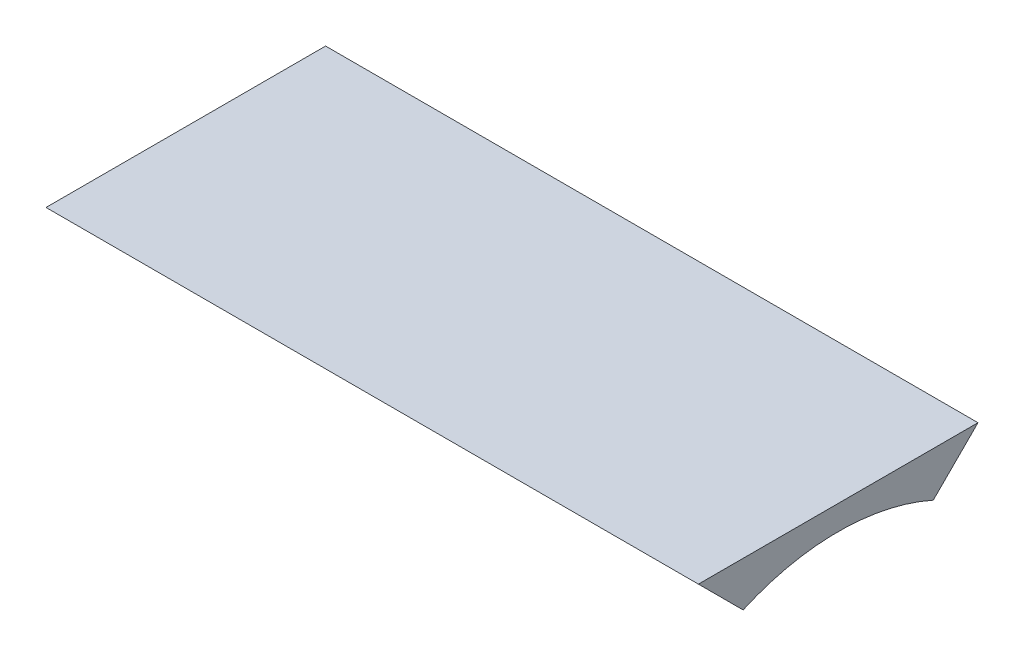
ISO-10303-21;
HEADER;
FILE_DESCRIPTION(('STEP AP214'),'2;1');
FILE_NAME('part.step','',(''),(''),'','','');
FILE_SCHEMA(('AUTOMOTIVE_DESIGN { 1 0 10303 214 1 1 1 1 }'));
ENDSEC;
DATA;
#1=APPLICATION_CONTEXT('core data for automotive mechanical design processes');
#2=APPLICATION_PROTOCOL_DEFINITION('international standard','automotive_design',2000,#1);
#3=PRODUCT_CONTEXT('',#1,'mechanical');
#4=PRODUCT('Part','Part','',(#3));
#5=PRODUCT_RELATED_PRODUCT_CATEGORY('part','',(#4));
#6=PRODUCT_DEFINITION_FORMATION('','',#4);
#7=PRODUCT_DEFINITION_CONTEXT('part definition',#1,'design');
#8=PRODUCT_DEFINITION('design','',#6,#7);
#9=PRODUCT_DEFINITION_SHAPE('','',#8);
#10=(LENGTH_UNIT() NAMED_UNIT(*) SI_UNIT(.MILLI.,.METRE.));
#11=(NAMED_UNIT(*) PLANE_ANGLE_UNIT() SI_UNIT($,.RADIAN.));
#12=(NAMED_UNIT(*) SI_UNIT($,.STERADIAN.) SOLID_ANGLE_UNIT());
#13=UNCERTAINTY_MEASURE_WITH_UNIT(LENGTH_MEASURE(1.E-05),#10,'distance_accuracy_value','');
#14=(GEOMETRIC_REPRESENTATION_CONTEXT(3) GLOBAL_UNCERTAINTY_ASSIGNED_CONTEXT((#13)) GLOBAL_UNIT_ASSIGNED_CONTEXT((#10,
#11,#12)) REPRESENTATION_CONTEXT('',''));
#15=CARTESIAN_POINT('',(0.,0.,0.));
#16=DIRECTION('',(0.,0.,1.));
#17=DIRECTION('',(1.,0.,0.));
#18=AXIS2_PLACEMENT_3D('',#15,#16,#17);
#19=CARTESIAN_POINT('',(70.,0.,0.));
#20=DIRECTION('',(-1.,0.,0.));
#21=DIRECTION('',(0.,0.,1.));
#22=AXIS2_PLACEMENT_3D('',#19,#20,#21);
#23=CYLINDRICAL_SURFACE('',#22,25.);
#24=CARTESIAN_POINT('',(0.,0.,0.));
#25=DIRECTION('',(1.,0.,0.));
#26=DIRECTION('',(0.,0.,-1.));
#27=AXIS2_PLACEMENT_3D('',#24,#25,#26);
#28=CIRCLE('',#27,25.);
#29=CARTESIAN_POINT('',(0.,22.8245481882994,-10.1999999999999));
#30=VERTEX_POINT('',#29);
#31=CARTESIAN_POINT('',(0.,22.8245481882994,10.1999999999999));
#32=VERTEX_POINT('',#31);
#33=EDGE_CURVE('E98',#30,#32,#28,.T.);
#34=ORIENTED_EDGE('',*,*,#33,.F.);
#35=DIRECTION('',(-1.,0.,0.));
#36=VECTOR('',#35,1.);
#37=CARTESIAN_POINT('',(70.,22.8245481882994,-10.1999999999999));
#38=LINE('',#37,#36);
#39=CARTESIAN_POINT('',(70.,22.8245481882994,-10.1999999999999));
#40=VERTEX_POINT('',#39);
#41=EDGE_CURVE('E11',#40,#30,#38,.T.);
#42=ORIENTED_EDGE('',*,*,#41,.F.);
#43=CARTESIAN_POINT('',(70.,0.,0.));
#44=DIRECTION('',(1.,0.,0.));
#45=DIRECTION('',(0.,0.,-1.));
#46=AXIS2_PLACEMENT_3D('',#43,#44,#45);
#47=CIRCLE('',#46,25.);
#48=CARTESIAN_POINT('',(70.,22.8245481882994,10.1999999999999));
#49=VERTEX_POINT('',#48);
#50=EDGE_CURVE('E90',#40,#49,#47,.T.);
#51=ORIENTED_EDGE('',*,*,#50,.T.);
#52=DIRECTION('',(-1.,0.,0.));
#53=VECTOR('',#52,1.);
#54=CARTESIAN_POINT('',(70.,22.8245481882994,10.1999999999999));
#55=LINE('',#54,#53);
#56=EDGE_CURVE('E51',#49,#32,#55,.T.);
#57=ORIENTED_EDGE('',*,*,#56,.T.);
#58=EDGE_LOOP('',(#34,#42,#51,#57));
#59=FACE_BOUND('',#58,.T.);
#60=ADVANCED_FACE('F35',(#59),#23,.F.);
#61=CARTESIAN_POINT('',(70.,6.31227409414986,6.31227409414979));
#62=DIRECTION('',(0.,-0.707106781186551,-0.707106781186544));
#63=DIRECTION('',(0.,0.707106781186544,-0.707106781186551));
#64=AXIS2_PLACEMENT_3D('',#61,#62,#63);
#65=PLANE('',#64);
#66=DIRECTION('',(0.,-0.707106781186544,0.707106781186551));
#67=VECTOR('',#66,1.);
#68=CARTESIAN_POINT('',(0.,6.31227409414986,6.31227409414979));
#69=LINE('',#68,#67);
#70=CARTESIAN_POINT('',(0.,27.6245481882994,-15.));
#71=VERTEX_POINT('',#70);
#72=EDGE_CURVE('E81',#71,#30,#69,.T.);
#73=ORIENTED_EDGE('',*,*,#72,.F.);
#74=DIRECTION('',(-1.,0.,0.));
#75=VECTOR('',#74,1.);
#76=CARTESIAN_POINT('',(70.,27.6245481882994,-15.));
#77=LINE('',#76,#75);
#78=CARTESIAN_POINT('',(70.,27.6245481882994,-15.));
#79=VERTEX_POINT('',#78);
#80=EDGE_CURVE('E43',#79,#71,#77,.T.);
#81=ORIENTED_EDGE('',*,*,#80,.F.);
#82=DIRECTION('',(0.,-0.707106781186544,0.707106781186551));
#83=VECTOR('',#82,1.);
#84=CARTESIAN_POINT('',(70.,6.31227409414986,6.31227409414979));
#85=LINE('',#84,#83);
#86=EDGE_CURVE('E79',#79,#40,#85,.T.);
#87=ORIENTED_EDGE('',*,*,#86,.T.);
#88=ORIENTED_EDGE('',*,*,#41,.T.);
#89=EDGE_LOOP('',(#73,#81,#87,#88));
#90=FACE_BOUND('',#89,.T.);
#91=ADVANCED_FACE('F78',(#90),#65,.T.);
#92=CARTESIAN_POINT('',(70.,27.6245481882994,0.));
#93=DIRECTION('',(0.,1.,0.));
#94=DIRECTION('',(0.,0.,1.));
#95=AXIS2_PLACEMENT_3D('',#92,#93,#94);
#96=PLANE('',#95);
#97=DIRECTION('',(0.,0.,-1.));
#98=VECTOR('',#97,1.);
#99=CARTESIAN_POINT('',(0.,27.6245481882994,0.));
#100=LINE('',#99,#98);
#101=CARTESIAN_POINT('',(0.,27.6245481882994,15.));
#102=VERTEX_POINT('',#101);
#103=EDGE_CURVE('E101',#102,#71,#100,.T.);
#104=ORIENTED_EDGE('',*,*,#103,.F.);
#105=DIRECTION('',(-1.,0.,0.));
#106=VECTOR('',#105,1.);
#107=CARTESIAN_POINT('',(70.,27.6245481882994,15.));
#108=LINE('',#107,#106);
#109=CARTESIAN_POINT('',(70.,27.6245481882994,15.));
#110=VERTEX_POINT('',#109);
#111=EDGE_CURVE('E64',#110,#102,#108,.T.);
#112=ORIENTED_EDGE('',*,*,#111,.F.);
#113=DIRECTION('',(0.,0.,-1.));
#114=VECTOR('',#113,1.);
#115=CARTESIAN_POINT('',(70.,27.6245481882994,0.));
#116=LINE('',#115,#114);
#117=EDGE_CURVE('E89',#110,#79,#116,.T.);
#118=ORIENTED_EDGE('',*,*,#117,.T.);
#119=ORIENTED_EDGE('',*,*,#80,.T.);
#120=EDGE_LOOP('',(#104,#112,#118,#119));
#121=FACE_BOUND('',#120,.T.);
#122=ADVANCED_FACE('F92',(#121),#96,.T.);
#123=CARTESIAN_POINT('',(70.,6.31227409414985,-6.31227409414978));
#124=DIRECTION('',(0.,-0.707106781186551,0.707106781186544));
#125=DIRECTION('',(0.,-0.707106781186544,-0.707106781186551));
#126=AXIS2_PLACEMENT_3D('',#123,#124,#125);
#127=PLANE('',#126);
#128=DIRECTION('',(0.,0.707106781186544,0.707106781186551));
#129=VECTOR('',#128,1.);
#130=CARTESIAN_POINT('',(0.,6.31227409414985,-6.31227409414978));
#131=LINE('',#130,#129);
#132=EDGE_CURVE('E103',#32,#102,#131,.T.);
#133=ORIENTED_EDGE('',*,*,#132,.F.);
#134=ORIENTED_EDGE('',*,*,#56,.F.);
#135=DIRECTION('',(0.,0.707106781186544,0.707106781186551));
#136=VECTOR('',#135,1.);
#137=CARTESIAN_POINT('',(70.,6.31227409414985,-6.31227409414978));
#138=LINE('',#137,#136);
#139=EDGE_CURVE('E93',#49,#110,#138,.T.);
#140=ORIENTED_EDGE('',*,*,#139,.T.);
#141=ORIENTED_EDGE('',*,*,#111,.T.);
#142=EDGE_LOOP('',(#133,#134,#140,#141));
#143=FACE_BOUND('',#142,.T.);
#144=ADVANCED_FACE('F108',(#143),#127,.T.);
#145=CARTESIAN_POINT('',(70.,0.,0.));
#146=DIRECTION('',(1.,0.,0.));
#147=DIRECTION('',(0.,0.,-1.));
#148=AXIS2_PLACEMENT_3D('',#145,#146,#147);
#149=PLANE('',#148);
#150=ORIENTED_EDGE('',*,*,#50,.F.);
#151=ORIENTED_EDGE('',*,*,#86,.F.);
#152=ORIENTED_EDGE('',*,*,#117,.F.);
#153=ORIENTED_EDGE('',*,*,#139,.F.);
#154=EDGE_LOOP('',(#150,#151,#152,#153));
#155=FACE_BOUND('',#154,.T.);
#156=ADVANCED_FACE('F87',(#155),#149,.T.);
#157=CARTESIAN_POINT('',(0.,0.,0.));
#158=DIRECTION('',(1.,0.,0.));
#159=DIRECTION('',(0.,0.,-1.));
#160=AXIS2_PLACEMENT_3D('',#157,#158,#159);
#161=PLANE('',#160);
#162=ORIENTED_EDGE('',*,*,#33,.T.);
#163=ORIENTED_EDGE('',*,*,#132,.T.);
#164=ORIENTED_EDGE('',*,*,#103,.T.);
#165=ORIENTED_EDGE('',*,*,#72,.T.);
#166=EDGE_LOOP('',(#162,#163,#164,#165));
#167=FACE_BOUND('',#166,.T.);
#168=ADVANCED_FACE('F115',(#167),#161,.F.);
#169=CLOSED_SHELL('',(#60,#91,#122,#144,#156,#168));
#170=MANIFOLD_SOLID_BREP('B2',#169);
#171=ADVANCED_BREP_SHAPE_REPRESENTATION('',(#18,#170),#14);
#172=SHAPE_DEFINITION_REPRESENTATION(#9,#171);
ENDSEC;
END-ISO-10303-21;
